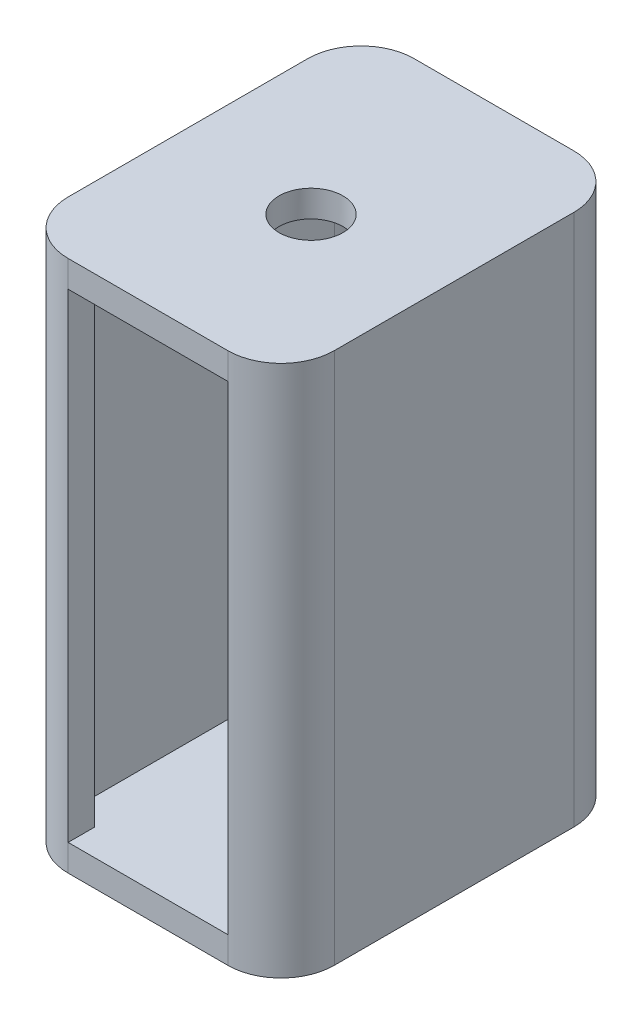
ISO-10303-21;
HEADER;
FILE_DESCRIPTION(('STEP AP214'),'2;1');
FILE_NAME('part.step','',(''),(''),'','','');
FILE_SCHEMA(('AUTOMOTIVE_DESIGN { 1 0 10303 214 1 1 1 1 }'));
ENDSEC;
DATA;
#1=APPLICATION_CONTEXT('core data for automotive mechanical design processes');
#2=APPLICATION_PROTOCOL_DEFINITION('international standard','automotive_design',2000,#1);
#3=PRODUCT_CONTEXT('',#1,'mechanical');
#4=PRODUCT('Part','Part','',(#3));
#5=PRODUCT_RELATED_PRODUCT_CATEGORY('part','',(#4));
#6=PRODUCT_DEFINITION_FORMATION('','',#4);
#7=PRODUCT_DEFINITION_CONTEXT('part definition',#1,'design');
#8=PRODUCT_DEFINITION('design','',#6,#7);
#9=PRODUCT_DEFINITION_SHAPE('','',#8);
#10=(LENGTH_UNIT() NAMED_UNIT(*) SI_UNIT(.MILLI.,.METRE.));
#11=(NAMED_UNIT(*) PLANE_ANGLE_UNIT() SI_UNIT($,.RADIAN.));
#12=(NAMED_UNIT(*) SI_UNIT($,.STERADIAN.) SOLID_ANGLE_UNIT());
#13=UNCERTAINTY_MEASURE_WITH_UNIT(LENGTH_MEASURE(1.E-05),#10,'distance_accuracy_value','');
#14=(GEOMETRIC_REPRESENTATION_CONTEXT(3) GLOBAL_UNCERTAINTY_ASSIGNED_CONTEXT((#13)) GLOBAL_UNIT_ASSIGNED_CONTEXT((#10,
#11,#12)) REPRESENTATION_CONTEXT('',''));
#15=CARTESIAN_POINT('',(0.,0.,0.));
#16=DIRECTION('',(0.,0.,1.));
#17=DIRECTION('',(1.,0.,0.));
#18=AXIS2_PLACEMENT_3D('',#15,#16,#17);
#19=CARTESIAN_POINT('',(50.,0.,0.));
#20=DIRECTION('',(0.,0.,-1.));
#21=DIRECTION('',(-1.,0.,0.));
#22=AXIS2_PLACEMENT_3D('',#19,#20,#21);
#23=PLANE('',#22);
#24=DIRECTION('',(-1.,0.,0.));
#25=VECTOR('',#24,1.);
#26=CARTESIAN_POINT('',(50.,95.,0.));
#27=LINE('',#26,#25);
#28=CARTESIAN_POINT('',(40.,95.,0.));
#29=VERTEX_POINT('',#28);
#30=CARTESIAN_POINT('',(10.,95.,0.));
#31=VERTEX_POINT('',#30);
#32=EDGE_CURVE('E210',#29,#31,#27,.T.);
#33=ORIENTED_EDGE('',*,*,#32,.F.);
#34=DIRECTION('',(0.,-1.,0.));
#35=VECTOR('',#34,1.);
#36=CARTESIAN_POINT('',(40.,0.,0.));
#37=LINE('',#36,#35);
#38=CARTESIAN_POINT('',(40.,100.,0.));
#39=VERTEX_POINT('',#38);
#40=EDGE_CURVE('E242',#29,#39,#37,.F.);
#41=ORIENTED_EDGE('',*,*,#40,.T.);
#42=DIRECTION('',(-1.,0.,0.));
#43=VECTOR('',#42,1.);
#44=CARTESIAN_POINT('',(50.,100.,0.));
#45=LINE('',#44,#43);
#46=CARTESIAN_POINT('',(10.,100.,0.));
#47=VERTEX_POINT('',#46);
#48=EDGE_CURVE('E226',#39,#47,#45,.T.);
#49=ORIENTED_EDGE('',*,*,#48,.T.);
#50=DIRECTION('',(0.,-1.,0.));
#51=VECTOR('',#50,1.);
#52=CARTESIAN_POINT('',(10.,0.,0.));
#53=LINE('',#52,#51);
#54=EDGE_CURVE('E247',#47,#31,#53,.T.);
#55=ORIENTED_EDGE('',*,*,#54,.T.);
#56=EDGE_LOOP('',(#33,#41,#49,#55));
#57=FACE_BOUND('',#56,.T.);
#58=ADVANCED_FACE('F32',(#57),#23,.F.);
#59=CARTESIAN_POINT('',(40.,0.,0.));
#60=VERTEX_POINT('',#59);
#61=CARTESIAN_POINT('',(40.,5.,0.));
#62=VERTEX_POINT('',#61);
#63=EDGE_CURVE('E243',#60,#62,#37,.F.);
#64=ORIENTED_EDGE('',*,*,#63,.T.);
#65=DIRECTION('',(-1.,0.,0.));
#66=VECTOR('',#65,1.);
#67=CARTESIAN_POINT('',(50.,5.,0.));
#68=LINE('',#67,#66);
#69=CARTESIAN_POINT('',(10.,5.,0.));
#70=VERTEX_POINT('',#69);
#71=EDGE_CURVE('E195',#62,#70,#68,.T.);
#72=ORIENTED_EDGE('',*,*,#71,.T.);
#73=CARTESIAN_POINT('',(10.,0.,0.));
#74=VERTEX_POINT('',#73);
#75=EDGE_CURVE('E246',#70,#74,#53,.T.);
#76=ORIENTED_EDGE('',*,*,#75,.T.);
#77=DIRECTION('',(-1.,0.,0.));
#78=VECTOR('',#77,1.);
#79=CARTESIAN_POINT('',(50.,0.,0.));
#80=LINE('',#79,#78);
#81=EDGE_CURVE('E239',#60,#74,#80,.T.);
#82=ORIENTED_EDGE('',*,*,#81,.F.);
#83=EDGE_LOOP('',(#64,#72,#76,#82));
#84=FACE_BOUND('',#83,.T.);
#85=ADVANCED_FACE('F318',(#84),#23,.F.);
#86=CARTESIAN_POINT('',(50.,0.,0.));
#87=DIRECTION('',(0.,1.,0.));
#88=DIRECTION('',(0.,0.,1.));
#89=AXIS2_PLACEMENT_3D('',#86,#87,#88);
#90=PLANE('',#89);
#91=CARTESIAN_POINT('',(25.6238501152097,0.,-30.));
#92=DIRECTION('',(0.,1.,0.));
#93=DIRECTION('',(0.,0.,1.));
#94=AXIS2_PLACEMENT_3D('',#91,#92,#93);
#95=CIRCLE('',#94,6.);
#96=CARTESIAN_POINT('',(25.6238501152097,0.,-24.));
#97=VERTEX_POINT('',#96);
#98=EDGE_CURVE('E498',#97,#97,#95,.T.);
#99=ORIENTED_EDGE('',*,*,#98,.T.);
#100=EDGE_LOOP('',(#99));
#101=FACE_BOUND('',#100,.T.);
#102=ORIENTED_EDGE('',*,*,#81,.T.);
#103=CARTESIAN_POINT('',(10.,0.,-10.));
#104=DIRECTION('',(0.,1.,0.));
#105=DIRECTION('',(0.,0.,1.));
#106=AXIS2_PLACEMENT_3D('',#103,#104,#105);
#107=CIRCLE('',#106,10.);
#108=CARTESIAN_POINT('',(0.,0.,-10.));
#109=VERTEX_POINT('',#108);
#110=EDGE_CURVE('E256',#74,#109,#107,.F.);
#111=ORIENTED_EDGE('',*,*,#110,.T.);
#112=DIRECTION('',(0.,0.,-1.));
#113=VECTOR('',#112,1.);
#114=CARTESIAN_POINT('',(0.,0.,0.));
#115=LINE('',#114,#113);
#116=CARTESIAN_POINT('',(0.,0.,-55.));
#117=VERTEX_POINT('',#116);
#118=EDGE_CURVE('E201',#109,#117,#115,.T.);
#119=ORIENTED_EDGE('',*,*,#118,.T.);
#120=CARTESIAN_POINT('',(10.,0.,-55.));
#121=DIRECTION('',(0.,1.,0.));
#122=DIRECTION('',(0.,0.,1.));
#123=AXIS2_PLACEMENT_3D('',#120,#121,#122);
#124=CIRCLE('',#123,10.);
#125=CARTESIAN_POINT('',(10.,0.,-65.));
#126=VERTEX_POINT('',#125);
#127=EDGE_CURVE('E250',#117,#126,#124,.F.);
#128=ORIENTED_EDGE('',*,*,#127,.T.);
#129=DIRECTION('',(-1.,0.,0.));
#130=VECTOR('',#129,1.);
#131=CARTESIAN_POINT('',(50.,0.,-65.));
#132=LINE('',#131,#130);
#133=CARTESIAN_POINT('',(40.,0.,-65.));
#134=VERTEX_POINT('',#133);
#135=EDGE_CURVE('E236',#134,#126,#132,.T.);
#136=ORIENTED_EDGE('',*,*,#135,.F.);
#137=CARTESIAN_POINT('',(40.,0.,-55.));
#138=DIRECTION('',(0.,1.,0.));
#139=DIRECTION('',(0.,0.,1.));
#140=AXIS2_PLACEMENT_3D('',#137,#138,#139);
#141=CIRCLE('',#140,10.);
#142=CARTESIAN_POINT('',(50.,0.,-55.));
#143=VERTEX_POINT('',#142);
#144=EDGE_CURVE('E252',#134,#143,#141,.F.);
#145=ORIENTED_EDGE('',*,*,#144,.T.);
#146=DIRECTION('',(0.,0.,-1.));
#147=VECTOR('',#146,1.);
#148=CARTESIAN_POINT('',(50.,0.,0.));
#149=LINE('',#148,#147);
#150=CARTESIAN_POINT('',(50.,0.,-10.));
#151=VERTEX_POINT('',#150);
#152=EDGE_CURVE('E219',#151,#143,#149,.T.);
#153=ORIENTED_EDGE('',*,*,#152,.F.);
#154=CARTESIAN_POINT('',(40.,0.,-10.));
#155=DIRECTION('',(0.,1.,0.));
#156=DIRECTION('',(0.,0.,1.));
#157=AXIS2_PLACEMENT_3D('',#154,#155,#156);
#158=CIRCLE('',#157,10.);
#159=EDGE_CURVE('E254',#151,#60,#158,.F.);
#160=ORIENTED_EDGE('',*,*,#159,.T.);
#161=EDGE_LOOP('',(#102,#111,#119,#128,#136,#145,#153,#160));
#162=FACE_BOUND('',#161,.T.);
#163=ADVANCED_FACE('F294',(#101,#162),#90,.F.);
#164=CARTESIAN_POINT('',(50.,0.,-65.));
#165=DIRECTION('',(0.,0.,1.));
#166=DIRECTION('',(1.,0.,0.));
#167=AXIS2_PLACEMENT_3D('',#164,#165,#166);
#168=PLANE('',#167);
#169=DIRECTION('',(-1.,0.,0.));
#170=VECTOR('',#169,1.);
#171=CARTESIAN_POINT('',(50.,100.,-65.));
#172=LINE('',#171,#170);
#173=CARTESIAN_POINT('',(40.,100.,-65.));
#174=VERTEX_POINT('',#173);
#175=CARTESIAN_POINT('',(10.,100.,-65.));
#176=VERTEX_POINT('',#175);
#177=EDGE_CURVE('E233',#174,#176,#172,.T.);
#178=ORIENTED_EDGE('',*,*,#177,.F.);
#179=DIRECTION('',(0.,1.,0.));
#180=VECTOR('',#179,1.);
#181=CARTESIAN_POINT('',(40.,0.,-65.));
#182=LINE('',#181,#180);
#183=EDGE_CURVE('E11',#174,#134,#182,.F.);
#184=ORIENTED_EDGE('',*,*,#183,.T.);
#185=ORIENTED_EDGE('',*,*,#135,.T.);
#186=DIRECTION('',(0.,1.,0.));
#187=VECTOR('',#186,1.);
#188=CARTESIAN_POINT('',(10.,100.,-65.));
#189=LINE('',#188,#187);
#190=EDGE_CURVE('E41',#126,#176,#189,.T.);
#191=ORIENTED_EDGE('',*,*,#190,.T.);
#192=EDGE_LOOP('',(#178,#184,#185,#191));
#193=FACE_BOUND('',#192,.T.);
#194=ADVANCED_FACE('F277',(#193),#168,.F.);
#195=CARTESIAN_POINT('',(50.,100.,0.));
#196=DIRECTION('',(0.,-1.,0.));
#197=DIRECTION('',(0.,0.,-1.));
#198=AXIS2_PLACEMENT_3D('',#195,#196,#197);
#199=PLANE('',#198);
#200=CARTESIAN_POINT('',(25.6238501152097,100.,-30.));
#201=DIRECTION('',(0.,1.,0.));
#202=DIRECTION('',(0.,0.,1.));
#203=AXIS2_PLACEMENT_3D('',#200,#201,#202);
#204=CIRCLE('',#203,6.);
#205=CARTESIAN_POINT('',(25.6238501152097,100.,-24.));
#206=VERTEX_POINT('',#205);
#207=EDGE_CURVE('E499',#206,#206,#204,.T.);
#208=ORIENTED_EDGE('',*,*,#207,.F.);
#209=EDGE_LOOP('',(#208));
#210=FACE_BOUND('',#209,.T.);
#211=DIRECTION('',(0.,0.,1.));
#212=VECTOR('',#211,1.);
#213=CARTESIAN_POINT('',(0.,100.,0.));
#214=LINE('',#213,#212);
#215=CARTESIAN_POINT('',(0.,100.,-55.));
#216=VERTEX_POINT('',#215);
#217=CARTESIAN_POINT('',(0.,100.,-10.));
#218=VERTEX_POINT('',#217);
#219=EDGE_CURVE('E223',#216,#218,#214,.T.);
#220=ORIENTED_EDGE('',*,*,#219,.T.);
#221=CARTESIAN_POINT('',(10.,100.,-10.));
#222=DIRECTION('',(0.,-1.,0.));
#223=DIRECTION('',(0.,0.,-1.));
#224=AXIS2_PLACEMENT_3D('',#221,#222,#223);
#225=CIRCLE('',#224,10.);
#226=EDGE_CURVE('E267',#218,#47,#225,.F.);
#227=ORIENTED_EDGE('',*,*,#226,.T.);
#228=ORIENTED_EDGE('',*,*,#48,.F.);
#229=CARTESIAN_POINT('',(40.,100.,-10.));
#230=DIRECTION('',(0.,-1.,0.));
#231=DIRECTION('',(0.,0.,-1.));
#232=AXIS2_PLACEMENT_3D('',#229,#230,#231);
#233=CIRCLE('',#232,10.);
#234=CARTESIAN_POINT('',(50.,100.,-10.));
#235=VERTEX_POINT('',#234);
#236=EDGE_CURVE('E265',#39,#235,#233,.F.);
#237=ORIENTED_EDGE('',*,*,#236,.T.);
#238=DIRECTION('',(0.,0.,1.));
#239=VECTOR('',#238,1.);
#240=CARTESIAN_POINT('',(50.,100.,0.));
#241=LINE('',#240,#239);
#242=CARTESIAN_POINT('',(50.,100.,-55.));
#243=VERTEX_POINT('',#242);
#244=EDGE_CURVE('E222',#243,#235,#241,.T.);
#245=ORIENTED_EDGE('',*,*,#244,.F.);
#246=CARTESIAN_POINT('',(40.,100.,-55.));
#247=DIRECTION('',(0.,-1.,0.));
#248=DIRECTION('',(0.,0.,-1.));
#249=AXIS2_PLACEMENT_3D('',#246,#247,#248);
#250=CIRCLE('',#249,10.);
#251=EDGE_CURVE('E263',#243,#174,#250,.F.);
#252=ORIENTED_EDGE('',*,*,#251,.T.);
#253=ORIENTED_EDGE('',*,*,#177,.T.);
#254=CARTESIAN_POINT('',(10.,100.,-55.));
#255=DIRECTION('',(0.,-1.,0.));
#256=DIRECTION('',(0.,0.,-1.));
#257=AXIS2_PLACEMENT_3D('',#254,#255,#256);
#258=CIRCLE('',#257,10.);
#259=EDGE_CURVE('E56',#176,#216,#258,.F.);
#260=ORIENTED_EDGE('',*,*,#259,.T.);
#261=EDGE_LOOP('',(#220,#227,#228,#237,#245,#252,#253,#260));
#262=FACE_BOUND('',#261,.T.);
#263=ADVANCED_FACE('F282',(#210,#262),#199,.F.);
#264=CARTESIAN_POINT('',(50.,0.,0.));
#265=DIRECTION('',(-1.,0.,0.));
#266=DIRECTION('',(0.,0.,1.));
#267=AXIS2_PLACEMENT_3D('',#264,#265,#266);
#268=PLANE('',#267);
#269=ORIENTED_EDGE('',*,*,#244,.T.);
#270=DIRECTION('',(0.,-1.,0.));
#271=VECTOR('',#270,1.);
#272=CARTESIAN_POINT('',(50.,0.,-10.));
#273=LINE('',#272,#271);
#274=EDGE_CURVE('E272',#235,#151,#273,.T.);
#275=ORIENTED_EDGE('',*,*,#274,.T.);
#276=ORIENTED_EDGE('',*,*,#152,.T.);
#277=DIRECTION('',(0.,1.,0.));
#278=VECTOR('',#277,1.);
#279=CARTESIAN_POINT('',(50.,0.,-55.));
#280=LINE('',#279,#278);
#281=EDGE_CURVE('E269',#143,#243,#280,.T.);
#282=ORIENTED_EDGE('',*,*,#281,.T.);
#283=EDGE_LOOP('',(#269,#275,#276,#282));
#284=FACE_BOUND('',#283,.T.);
#285=ADVANCED_FACE('F290',(#284),#268,.F.);
#286=CARTESIAN_POINT('',(0.,0.,0.));
#287=DIRECTION('',(-1.,0.,0.));
#288=DIRECTION('',(0.,0.,1.));
#289=AXIS2_PLACEMENT_3D('',#286,#287,#288);
#290=PLANE('',#289);
#291=ORIENTED_EDGE('',*,*,#118,.F.);
#292=DIRECTION('',(0.,-1.,0.));
#293=VECTOR('',#292,1.);
#294=CARTESIAN_POINT('',(0.,100.,-10.));
#295=LINE('',#294,#293);
#296=EDGE_CURVE('E260',#109,#218,#295,.F.);
#297=ORIENTED_EDGE('',*,*,#296,.T.);
#298=ORIENTED_EDGE('',*,*,#219,.F.);
#299=DIRECTION('',(0.,1.,0.));
#300=VECTOR('',#299,1.);
#301=CARTESIAN_POINT('',(0.,0.,-55.));
#302=LINE('',#301,#300);
#303=EDGE_CURVE('E258',#216,#117,#302,.F.);
#304=ORIENTED_EDGE('',*,*,#303,.T.);
#305=EDGE_LOOP('',(#291,#297,#298,#304));
#306=FACE_BOUND('',#305,.T.);
#307=ADVANCED_FACE('F298',(#306),#290,.T.);
#308=CARTESIAN_POINT('',(10.,0.,-10.));
#309=DIRECTION('',(0.,1.,0.));
#310=DIRECTION('',(0.,0.,1.));
#311=AXIS2_PLACEMENT_3D('',#308,#309,#310);
#312=CYLINDRICAL_SURFACE('',#311,10.);
#313=ORIENTED_EDGE('',*,*,#226,.F.);
#314=ORIENTED_EDGE('',*,*,#296,.F.);
#315=ORIENTED_EDGE('',*,*,#110,.F.);
#316=ORIENTED_EDGE('',*,*,#75,.F.);
#317=DIRECTION('',(0.,-1.,0.));
#318=VECTOR('',#317,1.);
#319=CARTESIAN_POINT('',(10.,0.,0.));
#320=LINE('',#319,#318);
#321=EDGE_CURVE('E308',#31,#70,#320,.T.);
#322=ORIENTED_EDGE('',*,*,#321,.F.);
#323=ORIENTED_EDGE('',*,*,#54,.F.);
#324=EDGE_LOOP('',(#313,#314,#315,#316,#322,#323));
#325=FACE_BOUND('',#324,.T.);
#326=ADVANCED_FACE('F304',(#325),#312,.T.);
#327=CARTESIAN_POINT('',(40.,0.,-10.));
#328=DIRECTION('',(0.,-1.,0.));
#329=DIRECTION('',(0.,0.,-1.));
#330=AXIS2_PLACEMENT_3D('',#327,#328,#329);
#331=CYLINDRICAL_SURFACE('',#330,10.);
#332=ORIENTED_EDGE('',*,*,#236,.F.);
#333=ORIENTED_EDGE('',*,*,#40,.F.);
#334=DIRECTION('',(0.,-1.,0.));
#335=VECTOR('',#334,1.);
#336=CARTESIAN_POINT('',(40.,0.,0.));
#337=LINE('',#336,#335);
#338=EDGE_CURVE('E198',#62,#29,#337,.F.);
#339=ORIENTED_EDGE('',*,*,#338,.F.);
#340=ORIENTED_EDGE('',*,*,#63,.F.);
#341=ORIENTED_EDGE('',*,*,#159,.F.);
#342=ORIENTED_EDGE('',*,*,#274,.F.);
#343=EDGE_LOOP('',(#332,#333,#339,#340,#341,#342));
#344=FACE_BOUND('',#343,.T.);
#345=ADVANCED_FACE('F314',(#344),#331,.T.);
#346=CARTESIAN_POINT('',(40.,0.,-55.));
#347=DIRECTION('',(0.,1.,0.));
#348=DIRECTION('',(0.,0.,1.));
#349=AXIS2_PLACEMENT_3D('',#346,#347,#348);
#350=CYLINDRICAL_SURFACE('',#349,10.);
#351=ORIENTED_EDGE('',*,*,#144,.F.);
#352=ORIENTED_EDGE('',*,*,#183,.F.);
#353=ORIENTED_EDGE('',*,*,#251,.F.);
#354=ORIENTED_EDGE('',*,*,#281,.F.);
#355=EDGE_LOOP('',(#351,#352,#353,#354));
#356=FACE_BOUND('',#355,.T.);
#357=ADVANCED_FACE('F288',(#356),#350,.T.);
#358=CARTESIAN_POINT('',(10.,0.,-55.));
#359=DIRECTION('',(0.,-1.,0.));
#360=DIRECTION('',(0.,0.,-1.));
#361=AXIS2_PLACEMENT_3D('',#358,#359,#360);
#362=CYLINDRICAL_SURFACE('',#361,10.);
#363=ORIENTED_EDGE('',*,*,#127,.F.);
#364=ORIENTED_EDGE('',*,*,#303,.F.);
#365=ORIENTED_EDGE('',*,*,#259,.F.);
#366=ORIENTED_EDGE('',*,*,#190,.F.);
#367=EDGE_LOOP('',(#363,#364,#365,#366));
#368=FACE_BOUND('',#367,.T.);
#369=ADVANCED_FACE('F34',(#368),#362,.T.);
#370=CARTESIAN_POINT('',(40.,0.,0.));
#371=DIRECTION('',(1.,0.,0.));
#372=DIRECTION('',(0.,-1.,0.));
#373=AXIS2_PLACEMENT_3D('',#370,#371,#372);
#374=PLANE('',#373);
#375=ORIENTED_EDGE('',*,*,#338,.T.);
#376=DIRECTION('',(0.,0.,1.));
#377=VECTOR('',#376,1.);
#378=CARTESIAN_POINT('',(40.,95.,0.));
#379=LINE('',#378,#377);
#380=CARTESIAN_POINT('',(40.,95.,-5.));
#381=VERTEX_POINT('',#380);
#382=EDGE_CURVE('E202',#381,#29,#379,.T.);
#383=ORIENTED_EDGE('',*,*,#382,.F.);
#384=DIRECTION('',(0.,-1.,0.));
#385=VECTOR('',#384,1.);
#386=CARTESIAN_POINT('',(40.,50.,-5.));
#387=LINE('',#386,#385);
#388=CARTESIAN_POINT('',(40.,5.,-5.));
#389=VERTEX_POINT('',#388);
#390=EDGE_CURVE('E203',#389,#381,#387,.F.);
#391=ORIENTED_EDGE('',*,*,#390,.F.);
#392=DIRECTION('',(0.,0.,1.));
#393=VECTOR('',#392,1.);
#394=CARTESIAN_POINT('',(40.,5.,0.));
#395=LINE('',#394,#393);
#396=EDGE_CURVE('E48',#389,#62,#395,.T.);
#397=ORIENTED_EDGE('',*,*,#396,.T.);
#398=EDGE_LOOP('',(#375,#383,#391,#397));
#399=FACE_BOUND('',#398,.T.);
#400=ADVANCED_FACE('F370',(#399),#374,.F.);
#401=CARTESIAN_POINT('',(10.,0.,0.));
#402=DIRECTION('',(1.,0.,0.));
#403=DIRECTION('',(0.,-1.,0.));
#404=AXIS2_PLACEMENT_3D('',#401,#402,#403);
#405=PLANE('',#404);
#406=ORIENTED_EDGE('',*,*,#321,.T.);
#407=DIRECTION('',(0.,0.,-1.));
#408=VECTOR('',#407,1.);
#409=CARTESIAN_POINT('',(10.,5.,0.));
#410=LINE('',#409,#408);
#411=CARTESIAN_POINT('',(10.,5.,-5.));
#412=VERTEX_POINT('',#411);
#413=EDGE_CURVE('E206',#412,#70,#410,.F.);
#414=ORIENTED_EDGE('',*,*,#413,.F.);
#415=DIRECTION('',(0.,1.,0.));
#416=VECTOR('',#415,1.);
#417=CARTESIAN_POINT('',(10.,50.,-5.));
#418=LINE('',#417,#416);
#419=CARTESIAN_POINT('',(10.,95.,-5.));
#420=VERTEX_POINT('',#419);
#421=EDGE_CURVE('E166',#420,#412,#418,.F.);
#422=ORIENTED_EDGE('',*,*,#421,.F.);
#423=DIRECTION('',(0.,0.,-1.));
#424=VECTOR('',#423,1.);
#425=CARTESIAN_POINT('',(10.,95.,0.));
#426=LINE('',#425,#424);
#427=EDGE_CURVE('E209',#420,#31,#426,.F.);
#428=ORIENTED_EDGE('',*,*,#427,.T.);
#429=EDGE_LOOP('',(#406,#414,#422,#428));
#430=FACE_BOUND('',#429,.T.);
#431=ADVANCED_FACE('F321',(#430),#405,.T.);
#432=CARTESIAN_POINT('',(50.,5.,0.));
#433=DIRECTION('',(0.,1.,0.));
#434=DIRECTION('',(0.,0.,1.));
#435=AXIS2_PLACEMENT_3D('',#432,#433,#434);
#436=PLANE('',#435);
#437=CARTESIAN_POINT('',(25.6238501152097,5.,-30.));
#438=DIRECTION('',(0.,1.,0.));
#439=DIRECTION('',(0.,0.,1.));
#440=AXIS2_PLACEMENT_3D('',#437,#438,#439);
#441=CIRCLE('',#440,6.);
#442=CARTESIAN_POINT('',(25.6238501152097,5.,-24.));
#443=VERTEX_POINT('',#442);
#444=EDGE_CURVE('E181',#443,#443,#441,.T.);
#445=ORIENTED_EDGE('',*,*,#444,.F.);
#446=EDGE_LOOP('',(#445));
#447=FACE_BOUND('',#446,.T.);
#448=ORIENTED_EDGE('',*,*,#71,.F.);
#449=ORIENTED_EDGE('',*,*,#396,.F.);
#450=CARTESIAN_POINT('',(40.,5.,-10.));
#451=DIRECTION('',(0.,1.,0.));
#452=DIRECTION('',(0.,0.,1.));
#453=AXIS2_PLACEMENT_3D('',#450,#451,#452);
#454=CIRCLE('',#453,5.);
#455=CARTESIAN_POINT('',(45.,5.,-10.));
#456=VERTEX_POINT('',#455);
#457=EDGE_CURVE('E170',#456,#389,#454,.F.);
#458=ORIENTED_EDGE('',*,*,#457,.F.);
#459=DIRECTION('',(0.,0.,-1.));
#460=VECTOR('',#459,1.);
#461=CARTESIAN_POINT('',(45.,5.,0.));
#462=LINE('',#461,#460);
#463=CARTESIAN_POINT('',(45.,5.,-55.));
#464=VERTEX_POINT('',#463);
#465=EDGE_CURVE('E330',#456,#464,#462,.T.);
#466=ORIENTED_EDGE('',*,*,#465,.T.);
#467=CARTESIAN_POINT('',(40.,5.,-55.));
#468=DIRECTION('',(0.,1.,0.));
#469=DIRECTION('',(0.,0.,1.));
#470=AXIS2_PLACEMENT_3D('',#467,#468,#469);
#471=CIRCLE('',#470,5.);
#472=CARTESIAN_POINT('',(40.,5.,-60.));
#473=VERTEX_POINT('',#472);
#474=EDGE_CURVE('E323',#473,#464,#471,.F.);
#475=ORIENTED_EDGE('',*,*,#474,.F.);
#476=DIRECTION('',(-1.,0.,0.));
#477=VECTOR('',#476,1.);
#478=CARTESIAN_POINT('',(50.,5.,-60.));
#479=LINE('',#478,#477);
#480=CARTESIAN_POINT('',(10.,5.,-60.));
#481=VERTEX_POINT('',#480);
#482=EDGE_CURVE('E199',#473,#481,#479,.T.);
#483=ORIENTED_EDGE('',*,*,#482,.T.);
#484=CARTESIAN_POINT('',(10.,5.,-55.));
#485=DIRECTION('',(0.,1.,0.));
#486=DIRECTION('',(0.,0.,1.));
#487=AXIS2_PLACEMENT_3D('',#484,#485,#486);
#488=CIRCLE('',#487,5.);
#489=CARTESIAN_POINT('',(5.,5.,-55.));
#490=VERTEX_POINT('',#489);
#491=EDGE_CURVE('E177',#490,#481,#488,.F.);
#492=ORIENTED_EDGE('',*,*,#491,.F.);
#493=DIRECTION('',(0.,0.,-1.));
#494=VECTOR('',#493,1.);
#495=CARTESIAN_POINT('',(5.,5.,0.));
#496=LINE('',#495,#494);
#497=CARTESIAN_POINT('',(5.,5.,-10.));
#498=VERTEX_POINT('',#497);
#499=EDGE_CURVE('E174',#498,#490,#496,.T.);
#500=ORIENTED_EDGE('',*,*,#499,.F.);
#501=CARTESIAN_POINT('',(10.,5.,-10.));
#502=DIRECTION('',(0.,1.,0.));
#503=DIRECTION('',(0.,0.,1.));
#504=AXIS2_PLACEMENT_3D('',#501,#502,#503);
#505=CIRCLE('',#504,5.);
#506=EDGE_CURVE('E158',#412,#498,#505,.F.);
#507=ORIENTED_EDGE('',*,*,#506,.F.);
#508=ORIENTED_EDGE('',*,*,#413,.T.);
#509=EDGE_LOOP('',(#448,#449,#458,#466,#475,#483,#492,#500,#507,#508));
#510=FACE_BOUND('',#509,.T.);
#511=ADVANCED_FACE('F175',(#447,#510),#436,.T.);
#512=CARTESIAN_POINT('',(50.,0.,-60.));
#513=DIRECTION('',(0.,0.,1.));
#514=DIRECTION('',(1.,0.,0.));
#515=AXIS2_PLACEMENT_3D('',#512,#513,#514);
#516=PLANE('',#515);
#517=DIRECTION('',(-1.,0.,0.));
#518=VECTOR('',#517,1.);
#519=CARTESIAN_POINT('',(50.,95.,-60.));
#520=LINE('',#519,#518);
#521=CARTESIAN_POINT('',(40.,95.,-60.));
#522=VERTEX_POINT('',#521);
#523=CARTESIAN_POINT('',(10.,95.,-60.));
#524=VERTEX_POINT('',#523);
#525=EDGE_CURVE('E212',#522,#524,#520,.T.);
#526=ORIENTED_EDGE('',*,*,#525,.T.);
#527=DIRECTION('',(0.,1.,0.));
#528=VECTOR('',#527,1.);
#529=CARTESIAN_POINT('',(10.,0.,-60.));
#530=LINE('',#529,#528);
#531=EDGE_CURVE('E337',#481,#524,#530,.T.);
#532=ORIENTED_EDGE('',*,*,#531,.F.);
#533=ORIENTED_EDGE('',*,*,#482,.F.);
#534=DIRECTION('',(0.,1.,0.));
#535=VECTOR('',#534,1.);
#536=CARTESIAN_POINT('',(40.,0.,-60.));
#537=LINE('',#536,#535);
#538=EDGE_CURVE('E217',#522,#473,#537,.F.);
#539=ORIENTED_EDGE('',*,*,#538,.F.);
#540=EDGE_LOOP('',(#526,#532,#533,#539));
#541=FACE_BOUND('',#540,.T.);
#542=ADVANCED_FACE('F368',(#541),#516,.T.);
#543=CARTESIAN_POINT('',(50.,95.,0.));
#544=DIRECTION('',(0.,-1.,0.));
#545=DIRECTION('',(0.,0.,-1.));
#546=AXIS2_PLACEMENT_3D('',#543,#544,#545);
#547=PLANE('',#546);
#548=CARTESIAN_POINT('',(25.6238501152097,95.,-30.));
#549=DIRECTION('',(0.,-1.,0.));
#550=DIRECTION('',(0.,0.,-1.));
#551=AXIS2_PLACEMENT_3D('',#548,#549,#550);
#552=CIRCLE('',#551,6.);
#553=CARTESIAN_POINT('',(25.6238501152097,95.,-36.));
#554=VERTEX_POINT('',#553);
#555=EDGE_CURVE('E36',#554,#554,#552,.T.);
#556=ORIENTED_EDGE('',*,*,#555,.F.);
#557=EDGE_LOOP('',(#556));
#558=FACE_BOUND('',#557,.T.);
#559=DIRECTION('',(0.,0.,1.));
#560=VECTOR('',#559,1.);
#561=CARTESIAN_POINT('',(5.,95.,0.));
#562=LINE('',#561,#560);
#563=CARTESIAN_POINT('',(5.,95.,-55.));
#564=VERTEX_POINT('',#563);
#565=CARTESIAN_POINT('',(5.,95.,-10.));
#566=VERTEX_POINT('',#565);
#567=EDGE_CURVE('E180',#564,#566,#562,.T.);
#568=ORIENTED_EDGE('',*,*,#567,.F.);
#569=CARTESIAN_POINT('',(10.,95.,-55.));
#570=DIRECTION('',(0.,-1.,0.));
#571=DIRECTION('',(0.,0.,-1.));
#572=AXIS2_PLACEMENT_3D('',#569,#570,#571);
#573=CIRCLE('',#572,5.);
#574=EDGE_CURVE('E186',#524,#564,#573,.F.);
#575=ORIENTED_EDGE('',*,*,#574,.F.);
#576=ORIENTED_EDGE('',*,*,#525,.F.);
#577=CARTESIAN_POINT('',(40.,95.,-55.));
#578=DIRECTION('',(0.,-1.,0.));
#579=DIRECTION('',(0.,0.,-1.));
#580=AXIS2_PLACEMENT_3D('',#577,#578,#579);
#581=CIRCLE('',#580,5.);
#582=CARTESIAN_POINT('',(45.,95.,-55.));
#583=VERTEX_POINT('',#582);
#584=EDGE_CURVE('E188',#583,#522,#581,.F.);
#585=ORIENTED_EDGE('',*,*,#584,.F.);
#586=DIRECTION('',(0.,0.,1.));
#587=VECTOR('',#586,1.);
#588=CARTESIAN_POINT('',(45.,95.,0.));
#589=LINE('',#588,#587);
#590=CARTESIAN_POINT('',(45.,95.,-10.));
#591=VERTEX_POINT('',#590);
#592=EDGE_CURVE('E213',#583,#591,#589,.T.);
#593=ORIENTED_EDGE('',*,*,#592,.T.);
#594=CARTESIAN_POINT('',(40.,95.,-10.));
#595=DIRECTION('',(0.,-1.,0.));
#596=DIRECTION('',(0.,0.,-1.));
#597=AXIS2_PLACEMENT_3D('',#594,#595,#596);
#598=CIRCLE('',#597,5.);
#599=EDGE_CURVE('E344',#381,#591,#598,.F.);
#600=ORIENTED_EDGE('',*,*,#599,.F.);
#601=ORIENTED_EDGE('',*,*,#382,.T.);
#602=ORIENTED_EDGE('',*,*,#32,.T.);
#603=ORIENTED_EDGE('',*,*,#427,.F.);
#604=CARTESIAN_POINT('',(10.,95.,-10.));
#605=DIRECTION('',(0.,-1.,0.));
#606=DIRECTION('',(0.,0.,-1.));
#607=AXIS2_PLACEMENT_3D('',#604,#605,#606);
#608=CIRCLE('',#607,5.);
#609=EDGE_CURVE('E342',#566,#420,#608,.F.);
#610=ORIENTED_EDGE('',*,*,#609,.F.);
#611=EDGE_LOOP('',(#568,#575,#576,#585,#593,#600,#601,#602,#603,#610));
#612=FACE_BOUND('',#611,.T.);
#613=ADVANCED_FACE('F363',(#558,#612),#547,.T.);
#614=CARTESIAN_POINT('',(45.,0.,0.));
#615=DIRECTION('',(-1.,0.,0.));
#616=DIRECTION('',(0.,0.,1.));
#617=AXIS2_PLACEMENT_3D('',#614,#615,#616);
#618=PLANE('',#617);
#619=ORIENTED_EDGE('',*,*,#592,.F.);
#620=DIRECTION('',(0.,1.,0.));
#621=VECTOR('',#620,1.);
#622=CARTESIAN_POINT('',(45.,0.,-55.));
#623=LINE('',#622,#621);
#624=EDGE_CURVE('E192',#464,#583,#623,.T.);
#625=ORIENTED_EDGE('',*,*,#624,.F.);
#626=ORIENTED_EDGE('',*,*,#465,.F.);
#627=DIRECTION('',(0.,1.,0.));
#628=VECTOR('',#627,1.);
#629=CARTESIAN_POINT('',(45.,0.,-10.));
#630=LINE('',#629,#628);
#631=EDGE_CURVE('E340',#591,#456,#630,.F.);
#632=ORIENTED_EDGE('',*,*,#631,.F.);
#633=EDGE_LOOP('',(#619,#625,#626,#632));
#634=FACE_BOUND('',#633,.T.);
#635=ADVANCED_FACE('F360',(#634),#618,.T.);
#636=CARTESIAN_POINT('',(5.,0.,0.));
#637=DIRECTION('',(-1.,0.,0.));
#638=DIRECTION('',(0.,0.,1.));
#639=AXIS2_PLACEMENT_3D('',#636,#637,#638);
#640=PLANE('',#639);
#641=ORIENTED_EDGE('',*,*,#499,.T.);
#642=DIRECTION('',(0.,1.,0.));
#643=VECTOR('',#642,1.);
#644=CARTESIAN_POINT('',(5.,0.,-55.));
#645=LINE('',#644,#643);
#646=EDGE_CURVE('E169',#564,#490,#645,.F.);
#647=ORIENTED_EDGE('',*,*,#646,.F.);
#648=ORIENTED_EDGE('',*,*,#567,.T.);
#649=DIRECTION('',(0.,1.,0.));
#650=VECTOR('',#649,1.);
#651=CARTESIAN_POINT('',(5.,0.,-10.));
#652=LINE('',#651,#650);
#653=EDGE_CURVE('E163',#498,#566,#652,.T.);
#654=ORIENTED_EDGE('',*,*,#653,.F.);
#655=EDGE_LOOP('',(#641,#647,#648,#654));
#656=FACE_BOUND('',#655,.T.);
#657=ADVANCED_FACE('F183',(#656),#640,.F.);
#658=CARTESIAN_POINT('',(10.,0.,-10.));
#659=DIRECTION('',(0.,1.,0.));
#660=DIRECTION('',(0.,0.,1.));
#661=AXIS2_PLACEMENT_3D('',#658,#659,#660);
#662=CYLINDRICAL_SURFACE('',#661,5.);
#663=ORIENTED_EDGE('',*,*,#609,.T.);
#664=ORIENTED_EDGE('',*,*,#421,.T.);
#665=ORIENTED_EDGE('',*,*,#506,.T.);
#666=ORIENTED_EDGE('',*,*,#653,.T.);
#667=EDGE_LOOP('',(#663,#664,#665,#666));
#668=FACE_BOUND('',#667,.T.);
#669=ADVANCED_FACE('F161',(#668),#662,.F.);
#670=CARTESIAN_POINT('',(40.,0.,-10.));
#671=DIRECTION('',(0.,-1.,0.));
#672=DIRECTION('',(0.,0.,-1.));
#673=AXIS2_PLACEMENT_3D('',#670,#671,#672);
#674=CYLINDRICAL_SURFACE('',#673,5.);
#675=ORIENTED_EDGE('',*,*,#599,.T.);
#676=ORIENTED_EDGE('',*,*,#631,.T.);
#677=ORIENTED_EDGE('',*,*,#457,.T.);
#678=ORIENTED_EDGE('',*,*,#390,.T.);
#679=EDGE_LOOP('',(#675,#676,#677,#678));
#680=FACE_BOUND('',#679,.T.);
#681=ADVANCED_FACE('F369',(#680),#674,.F.);
#682=CARTESIAN_POINT('',(40.,0.,-55.));
#683=DIRECTION('',(0.,1.,0.));
#684=DIRECTION('',(0.,0.,1.));
#685=AXIS2_PLACEMENT_3D('',#682,#683,#684);
#686=CYLINDRICAL_SURFACE('',#685,5.);
#687=ORIENTED_EDGE('',*,*,#474,.T.);
#688=ORIENTED_EDGE('',*,*,#624,.T.);
#689=ORIENTED_EDGE('',*,*,#584,.T.);
#690=ORIENTED_EDGE('',*,*,#538,.T.);
#691=EDGE_LOOP('',(#687,#688,#689,#690));
#692=FACE_BOUND('',#691,.T.);
#693=ADVANCED_FACE('F356',(#692),#686,.F.);
#694=CARTESIAN_POINT('',(10.,0.,-55.));
#695=DIRECTION('',(0.,-1.,0.));
#696=DIRECTION('',(0.,0.,-1.));
#697=AXIS2_PLACEMENT_3D('',#694,#695,#696);
#698=CYLINDRICAL_SURFACE('',#697,5.);
#699=ORIENTED_EDGE('',*,*,#491,.T.);
#700=ORIENTED_EDGE('',*,*,#531,.T.);
#701=ORIENTED_EDGE('',*,*,#574,.T.);
#702=ORIENTED_EDGE('',*,*,#646,.T.);
#703=EDGE_LOOP('',(#699,#700,#701,#702));
#704=FACE_BOUND('',#703,.T.);
#705=ADVANCED_FACE('F372',(#704),#698,.F.);
#706=CARTESIAN_POINT('',(25.6238501152097,0.,-30.));
#707=DIRECTION('',(0.,1.,0.));
#708=DIRECTION('',(0.,0.,1.));
#709=AXIS2_PLACEMENT_3D('',#706,#707,#708);
#710=CYLINDRICAL_SURFACE('',#709,6.);
#711=ORIENTED_EDGE('',*,*,#555,.T.);
#712=EDGE_LOOP('',(#711));
#713=FACE_BOUND('',#712,.T.);
#714=ORIENTED_EDGE('',*,*,#207,.T.);
#715=EDGE_LOOP('',(#714));
#716=FACE_BOUND('',#715,.T.);
#717=ADVANCED_FACE('F374',(#713,#716),#710,.F.);
#718=ORIENTED_EDGE('',*,*,#444,.T.);
#719=EDGE_LOOP('',(#718));
#720=FACE_BOUND('',#719,.T.);
#721=ORIENTED_EDGE('',*,*,#98,.F.);
#722=EDGE_LOOP('',(#721));
#723=FACE_BOUND('',#722,.T.);
#724=ADVANCED_FACE('F380',(#720,#723),#710,.F.);
#725=CLOSED_SHELL('',(#58,#85,#163,#194,#263,#285,#307,#326,#345,#357,#369,#400,#431,#511,#542,
#613,#635,#657,#669,#681,#693,#705,#717,#724));
#726=MANIFOLD_SOLID_BREP('B2',#725);
#727=ADVANCED_BREP_SHAPE_REPRESENTATION('',(#18,#726),#14);
#728=SHAPE_DEFINITION_REPRESENTATION(#9,#727);
ENDSEC;
END-ISO-10303-21;
